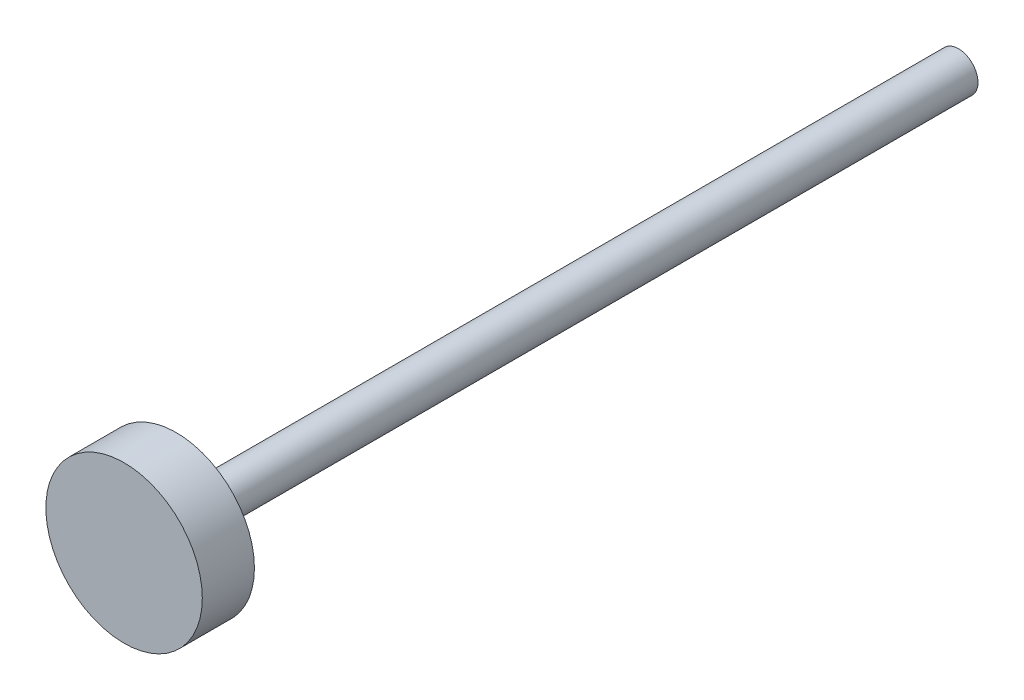
ISO-10303-21;
HEADER;
FILE_DESCRIPTION(('STEP AP214'),'2;1');
FILE_NAME('part.step','',(''),(''),'','','');
FILE_SCHEMA(('AUTOMOTIVE_DESIGN { 1 0 10303 214 1 1 1 1 }'));
ENDSEC;
DATA;
#1=APPLICATION_CONTEXT('core data for automotive mechanical design processes');
#2=APPLICATION_PROTOCOL_DEFINITION('international standard','automotive_design',2000,#1);
#3=PRODUCT_CONTEXT('',#1,'mechanical');
#4=PRODUCT('Part','Part','',(#3));
#5=PRODUCT_RELATED_PRODUCT_CATEGORY('part','',(#4));
#6=PRODUCT_DEFINITION_FORMATION('','',#4);
#7=PRODUCT_DEFINITION_CONTEXT('part definition',#1,'design');
#8=PRODUCT_DEFINITION('design','',#6,#7);
#9=PRODUCT_DEFINITION_SHAPE('','',#8);
#10=(LENGTH_UNIT() NAMED_UNIT(*) SI_UNIT(.MILLI.,.METRE.));
#11=(NAMED_UNIT(*) PLANE_ANGLE_UNIT() SI_UNIT($,.RADIAN.));
#12=(NAMED_UNIT(*) SI_UNIT($,.STERADIAN.) SOLID_ANGLE_UNIT());
#13=UNCERTAINTY_MEASURE_WITH_UNIT(LENGTH_MEASURE(1.E-05),#10,'distance_accuracy_value','');
#14=(GEOMETRIC_REPRESENTATION_CONTEXT(3) GLOBAL_UNCERTAINTY_ASSIGNED_CONTEXT((#13)) GLOBAL_UNIT_ASSIGNED_CONTEXT((#10,
#11,#12)) REPRESENTATION_CONTEXT('',''));
#15=CARTESIAN_POINT('',(0.,0.,0.));
#16=DIRECTION('',(0.,0.,1.));
#17=DIRECTION('',(1.,0.,0.));
#18=AXIS2_PLACEMENT_3D('',#15,#16,#17);
#19=CARTESIAN_POINT('',(0.,0.,0.));
#20=DIRECTION('',(0.,0.,-1.));
#21=DIRECTION('',(-1.,0.,0.));
#22=AXIS2_PLACEMENT_3D('',#19,#20,#21);
#23=PLANE('',#22);
#24=CARTESIAN_POINT('',(0.,0.,0.));
#25=DIRECTION('',(0.,0.,1.));
#26=DIRECTION('',(1.,0.,0.));
#27=AXIS2_PLACEMENT_3D('',#24,#25,#26);
#28=CIRCLE('',#27,1.5);
#29=CARTESIAN_POINT('',(1.5,0.,0.));
#30=VERTEX_POINT('',#29);
#31=EDGE_CURVE('E10',#30,#30,#28,.T.);
#32=ORIENTED_EDGE('',*,*,#31,.F.);
#33=EDGE_LOOP('',(#32));
#34=FACE_BOUND('',#33,.T.);
#35=ADVANCED_FACE('F37',(#34),#23,.T.);
#36=CARTESIAN_POINT('',(0.,0.,64.));
#37=DIRECTION('',(0.,0.,1.));
#38=DIRECTION('',(1.,0.,0.));
#39=AXIS2_PLACEMENT_3D('',#36,#37,#38);
#40=CYLINDRICAL_SURFACE('',#39,1.5);
#41=ORIENTED_EDGE('',*,*,#31,.T.);
#42=EDGE_LOOP('',(#41));
#43=FACE_BOUND('',#42,.T.);
#44=CARTESIAN_POINT('',(0.,0.,60.));
#45=DIRECTION('',(0.,0.,1.));
#46=DIRECTION('',(1.,0.,0.));
#47=AXIS2_PLACEMENT_3D('',#44,#45,#46);
#48=CIRCLE('',#47,1.5);
#49=CARTESIAN_POINT('',(1.5,0.,60.));
#50=VERTEX_POINT('',#49);
#51=EDGE_CURVE('E43',#50,#50,#48,.T.);
#52=ORIENTED_EDGE('',*,*,#51,.F.);
#53=EDGE_LOOP('',(#52));
#54=FACE_BOUND('',#53,.T.);
#55=ADVANCED_FACE('F69',(#43,#54),#40,.T.);
#56=CARTESIAN_POINT('',(0.,-1.5,60.));
#57=DIRECTION('',(0.,0.,-1.));
#58=DIRECTION('',(-1.,0.,0.));
#59=AXIS2_PLACEMENT_3D('',#56,#57,#58);
#60=PLANE('',#59);
#61=ORIENTED_EDGE('',*,*,#51,.T.);
#62=EDGE_LOOP('',(#61));
#63=FACE_BOUND('',#62,.T.);
#64=CARTESIAN_POINT('',(0.,0.,60.));
#65=DIRECTION('',(0.,0.,1.));
#66=DIRECTION('',(1.,0.,0.));
#67=AXIS2_PLACEMENT_3D('',#64,#65,#66);
#68=CIRCLE('',#67,6.);
#69=CARTESIAN_POINT('',(6.,0.,60.));
#70=VERTEX_POINT('',#69);
#71=EDGE_CURVE('E47',#70,#70,#68,.T.);
#72=ORIENTED_EDGE('',*,*,#71,.F.);
#73=EDGE_LOOP('',(#72));
#74=FACE_BOUND('',#73,.T.);
#75=ADVANCED_FACE('F61',(#63,#74),#60,.T.);
#76=CARTESIAN_POINT('',(0.,0.,64.));
#77=DIRECTION('',(0.,0.,1.));
#78=DIRECTION('',(1.,0.,0.));
#79=AXIS2_PLACEMENT_3D('',#76,#77,#78);
#80=CYLINDRICAL_SURFACE('',#79,6.);
#81=ORIENTED_EDGE('',*,*,#71,.T.);
#82=EDGE_LOOP('',(#81));
#83=FACE_BOUND('',#82,.T.);
#84=CARTESIAN_POINT('',(0.,0.,64.));
#85=DIRECTION('',(0.,0.,1.));
#86=DIRECTION('',(1.,0.,0.));
#87=AXIS2_PLACEMENT_3D('',#84,#85,#86);
#88=CIRCLE('',#87,6.);
#89=CARTESIAN_POINT('',(6.,0.,64.));
#90=VERTEX_POINT('',#89);
#91=EDGE_CURVE('E51',#90,#90,#88,.T.);
#92=ORIENTED_EDGE('',*,*,#91,.F.);
#93=EDGE_LOOP('',(#92));
#94=FACE_BOUND('',#93,.T.);
#95=ADVANCED_FACE('F59',(#83,#94),#80,.T.);
#96=CARTESIAN_POINT('',(0.,-6.,64.));
#97=DIRECTION('',(0.,0.,1.));
#98=DIRECTION('',(1.,0.,0.));
#99=AXIS2_PLACEMENT_3D('',#96,#97,#98);
#100=PLANE('',#99);
#101=ORIENTED_EDGE('',*,*,#91,.T.);
#102=EDGE_LOOP('',(#101));
#103=FACE_BOUND('',#102,.T.);
#104=ADVANCED_FACE('F57',(#103),#100,.T.);
#105=CLOSED_SHELL('',(#35,#55,#75,#95,#104));
#106=MANIFOLD_SOLID_BREP('B2',#105);
#107=ADVANCED_BREP_SHAPE_REPRESENTATION('',(#18,#106),#14);
#108=SHAPE_DEFINITION_REPRESENTATION(#9,#107);
ENDSEC;
END-ISO-10303-21;
